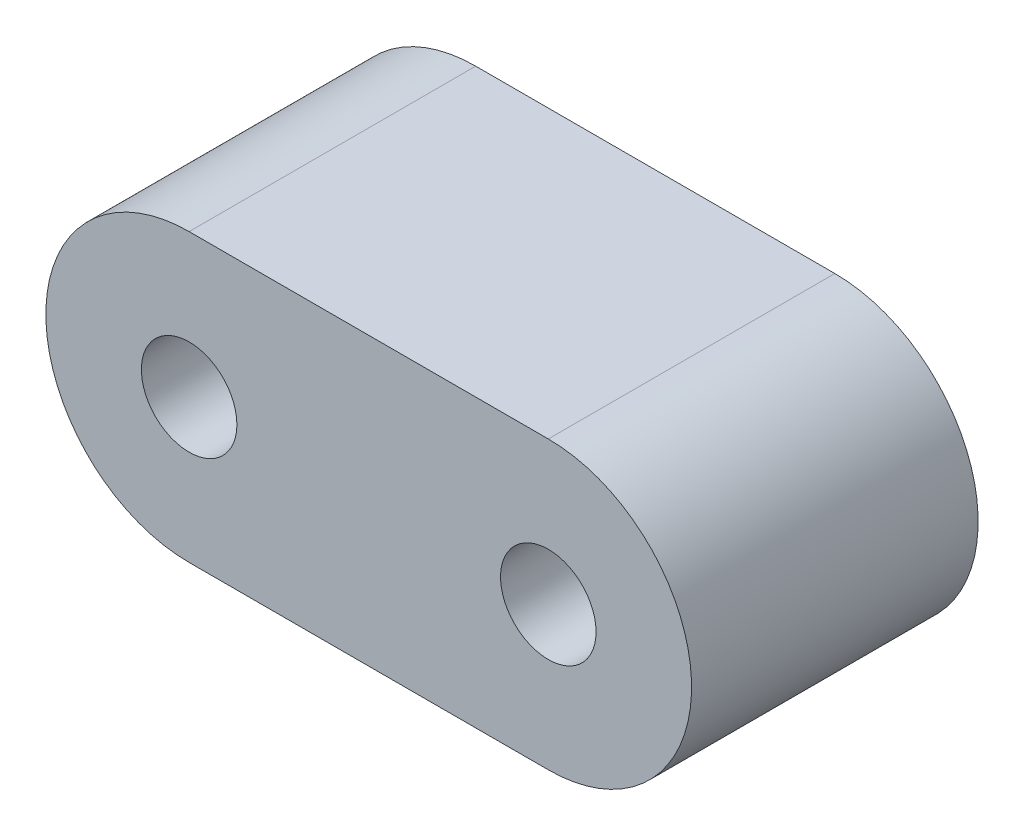
ISO-10303-21;
HEADER;
FILE_DESCRIPTION(('STEP AP214'),'2;1');
FILE_NAME('part.step','',(''),(''),'','','');
FILE_SCHEMA(('AUTOMOTIVE_DESIGN { 1 0 10303 214 1 1 1 1 }'));
ENDSEC;
DATA;
#1=APPLICATION_CONTEXT('core data for automotive mechanical design processes');
#2=APPLICATION_PROTOCOL_DEFINITION('international standard','automotive_design',2000,#1);
#3=PRODUCT_CONTEXT('',#1,'mechanical');
#4=PRODUCT('Part','Part','',(#3));
#5=PRODUCT_RELATED_PRODUCT_CATEGORY('part','',(#4));
#6=PRODUCT_DEFINITION_FORMATION('','',#4);
#7=PRODUCT_DEFINITION_CONTEXT('part definition',#1,'design');
#8=PRODUCT_DEFINITION('design','',#6,#7);
#9=PRODUCT_DEFINITION_SHAPE('','',#8);
#10=(LENGTH_UNIT() NAMED_UNIT(*) SI_UNIT(.MILLI.,.METRE.));
#11=(NAMED_UNIT(*) PLANE_ANGLE_UNIT() SI_UNIT($,.RADIAN.));
#12=(NAMED_UNIT(*) SI_UNIT($,.STERADIAN.) SOLID_ANGLE_UNIT());
#13=UNCERTAINTY_MEASURE_WITH_UNIT(LENGTH_MEASURE(1.E-05),#10,'distance_accuracy_value','');
#14=(GEOMETRIC_REPRESENTATION_CONTEXT(3) GLOBAL_UNCERTAINTY_ASSIGNED_CONTEXT((#13)) GLOBAL_UNIT_ASSIGNED_CONTEXT((#10,
#11,#12)) REPRESENTATION_CONTEXT('',''));
#15=CARTESIAN_POINT('',(0.,0.,0.));
#16=DIRECTION('',(0.,0.,1.));
#17=DIRECTION('',(1.,0.,0.));
#18=AXIS2_PLACEMENT_3D('',#15,#16,#17);
#19=CARTESIAN_POINT('',(0.,0.,1.5));
#20=DIRECTION('',(0.,0.,1.));
#21=DIRECTION('',(1.,0.,0.));
#22=AXIS2_PLACEMENT_3D('',#19,#20,#21);
#23=PLANE('',#22);
#24=CARTESIAN_POINT('',(0.,0.,1.5));
#25=DIRECTION('',(0.,0.,1.));
#26=DIRECTION('',(1.,0.,0.));
#27=AXIS2_PLACEMENT_3D('',#24,#25,#26);
#28=CIRCLE('',#27,0.5);
#29=CARTESIAN_POINT('',(0.5,0.,1.5));
#30=VERTEX_POINT('',#29);
#31=EDGE_CURVE('E100',#30,#30,#28,.T.);
#32=ORIENTED_EDGE('',*,*,#31,.F.);
#33=EDGE_LOOP('',(#32));
#34=FACE_BOUND('',#33,.T.);
#35=CARTESIAN_POINT('',(0.,0.,1.5));
#36=DIRECTION('',(0.,0.,1.));
#37=DIRECTION('',(1.,0.,0.));
#38=AXIS2_PLACEMENT_3D('',#35,#36,#37);
#39=CIRCLE('',#38,1.5);
#40=CARTESIAN_POINT('',(0.,1.5,1.5));
#41=VERTEX_POINT('',#40);
#42=CARTESIAN_POINT('',(0.,-1.5,1.5));
#43=VERTEX_POINT('',#42);
#44=EDGE_CURVE('E85',#41,#43,#39,.T.);
#45=ORIENTED_EDGE('',*,*,#44,.T.);
#46=DIRECTION('',(1.,0.,0.));
#47=VECTOR('',#46,1.);
#48=CARTESIAN_POINT('',(0.,-1.5,1.5));
#49=LINE('',#48,#47);
#50=CARTESIAN_POINT('',(3.76,-1.5,1.5));
#51=VERTEX_POINT('',#50);
#52=EDGE_CURVE('E80',#43,#51,#49,.T.);
#53=ORIENTED_EDGE('',*,*,#52,.T.);
#54=CARTESIAN_POINT('',(3.76,0.,1.5));
#55=DIRECTION('',(0.,0.,1.));
#56=DIRECTION('',(1.,0.,0.));
#57=AXIS2_PLACEMENT_3D('',#54,#55,#56);
#58=CIRCLE('',#57,1.5);
#59=CARTESIAN_POINT('',(3.76,1.5,1.5));
#60=VERTEX_POINT('',#59);
#61=EDGE_CURVE('E83',#51,#60,#58,.T.);
#62=ORIENTED_EDGE('',*,*,#61,.T.);
#63=DIRECTION('',(-1.,0.,0.));
#64=VECTOR('',#63,1.);
#65=CARTESIAN_POINT('',(0.,1.5,1.5));
#66=LINE('',#65,#64);
#67=EDGE_CURVE('E50',#60,#41,#66,.T.);
#68=ORIENTED_EDGE('',*,*,#67,.T.);
#69=EDGE_LOOP('',(#45,#53,#62,#68));
#70=FACE_BOUND('',#69,.T.);
#71=CARTESIAN_POINT('',(3.76,0.,1.5));
#72=DIRECTION('',(0.,0.,1.));
#73=DIRECTION('',(1.,0.,0.));
#74=AXIS2_PLACEMENT_3D('',#71,#72,#73);
#75=CIRCLE('',#74,0.500000000000001);
#76=CARTESIAN_POINT('',(4.26,0.,1.5));
#77=VERTEX_POINT('',#76);
#78=EDGE_CURVE('E115',#77,#77,#75,.T.);
#79=ORIENTED_EDGE('',*,*,#78,.F.);
#80=EDGE_LOOP('',(#79));
#81=FACE_BOUND('',#80,.T.);
#82=ADVANCED_FACE('F33',(#34,#70,#81),#23,.T.);
#83=CARTESIAN_POINT('',(0.,0.,-1.5));
#84=DIRECTION('',(0.,0.,1.));
#85=DIRECTION('',(1.,0.,0.));
#86=AXIS2_PLACEMENT_3D('',#83,#84,#85);
#87=PLANE('',#86);
#88=CARTESIAN_POINT('',(0.,0.,-1.5));
#89=DIRECTION('',(0.,0.,1.));
#90=DIRECTION('',(1.,0.,0.));
#91=AXIS2_PLACEMENT_3D('',#88,#89,#90);
#92=CIRCLE('',#91,1.5);
#93=CARTESIAN_POINT('',(0.,1.5,-1.5));
#94=VERTEX_POINT('',#93);
#95=CARTESIAN_POINT('',(0.,-1.5,-1.5));
#96=VERTEX_POINT('',#95);
#97=EDGE_CURVE('E97',#94,#96,#92,.T.);
#98=ORIENTED_EDGE('',*,*,#97,.F.);
#99=DIRECTION('',(-1.,0.,0.));
#100=VECTOR('',#99,1.);
#101=CARTESIAN_POINT('',(0.,1.5,-1.5));
#102=LINE('',#101,#100);
#103=CARTESIAN_POINT('',(3.76,1.5,-1.5));
#104=VERTEX_POINT('',#103);
#105=EDGE_CURVE('E73',#104,#94,#102,.T.);
#106=ORIENTED_EDGE('',*,*,#105,.F.);
#107=CARTESIAN_POINT('',(3.76,0.,-1.5));
#108=DIRECTION('',(0.,0.,1.));
#109=DIRECTION('',(1.,0.,0.));
#110=AXIS2_PLACEMENT_3D('',#107,#108,#109);
#111=CIRCLE('',#110,1.5);
#112=CARTESIAN_POINT('',(3.76,-1.5,-1.5));
#113=VERTEX_POINT('',#112);
#114=EDGE_CURVE('E67',#113,#104,#111,.T.);
#115=ORIENTED_EDGE('',*,*,#114,.F.);
#116=DIRECTION('',(1.,0.,0.));
#117=VECTOR('',#116,1.);
#118=CARTESIAN_POINT('',(0.,-1.5,-1.5));
#119=LINE('',#118,#117);
#120=EDGE_CURVE('E89',#96,#113,#119,.T.);
#121=ORIENTED_EDGE('',*,*,#120,.F.);
#122=EDGE_LOOP('',(#98,#106,#115,#121));
#123=FACE_BOUND('',#122,.T.);
#124=CARTESIAN_POINT('',(0.,0.,-1.5));
#125=DIRECTION('',(0.,0.,1.));
#126=DIRECTION('',(1.,0.,0.));
#127=AXIS2_PLACEMENT_3D('',#124,#125,#126);
#128=CIRCLE('',#127,0.5);
#129=CARTESIAN_POINT('',(0.5,0.,-1.5));
#130=VERTEX_POINT('',#129);
#131=EDGE_CURVE('E112',#130,#130,#128,.T.);
#132=ORIENTED_EDGE('',*,*,#131,.T.);
#133=EDGE_LOOP('',(#132));
#134=FACE_BOUND('',#133,.T.);
#135=CARTESIAN_POINT('',(3.76,0.,-1.5));
#136=DIRECTION('',(0.,0.,1.));
#137=DIRECTION('',(1.,0.,0.));
#138=AXIS2_PLACEMENT_3D('',#135,#136,#137);
#139=CIRCLE('',#138,0.500000000000001);
#140=CARTESIAN_POINT('',(4.26,0.,-1.5));
#141=VERTEX_POINT('',#140);
#142=EDGE_CURVE('E118',#141,#141,#139,.T.);
#143=ORIENTED_EDGE('',*,*,#142,.T.);
#144=EDGE_LOOP('',(#143));
#145=FACE_BOUND('',#144,.T.);
#146=ADVANCED_FACE('F108',(#123,#134,#145),#87,.F.);
#147=CARTESIAN_POINT('',(0.,0.,1.5));
#148=DIRECTION('',(0.,0.,-1.));
#149=DIRECTION('',(-1.,0.,0.));
#150=AXIS2_PLACEMENT_3D('',#147,#148,#149);
#151=CYLINDRICAL_SURFACE('',#150,1.5);
#152=ORIENTED_EDGE('',*,*,#97,.T.);
#153=DIRECTION('',(0.,0.,-1.));
#154=VECTOR('',#153,1.);
#155=CARTESIAN_POINT('',(0.,-1.5,1.5));
#156=LINE('',#155,#154);
#157=EDGE_CURVE('E11',#43,#96,#156,.T.);
#158=ORIENTED_EDGE('',*,*,#157,.F.);
#159=ORIENTED_EDGE('',*,*,#44,.F.);
#160=DIRECTION('',(0.,0.,-1.));
#161=VECTOR('',#160,1.);
#162=CARTESIAN_POINT('',(0.,1.5,1.5));
#163=LINE('',#162,#161);
#164=EDGE_CURVE('E93',#41,#94,#163,.T.);
#165=ORIENTED_EDGE('',*,*,#164,.T.);
#166=EDGE_LOOP('',(#152,#158,#159,#165));
#167=FACE_BOUND('',#166,.T.);
#168=ADVANCED_FACE('F35',(#167),#151,.T.);
#169=CARTESIAN_POINT('',(0.,-1.5,1.5));
#170=DIRECTION('',(0.,1.,0.));
#171=DIRECTION('',(0.,0.,1.));
#172=AXIS2_PLACEMENT_3D('',#169,#170,#171);
#173=PLANE('',#172);
#174=ORIENTED_EDGE('',*,*,#120,.T.);
#175=DIRECTION('',(0.,0.,-1.));
#176=VECTOR('',#175,1.);
#177=CARTESIAN_POINT('',(3.76,-1.5,1.5));
#178=LINE('',#177,#176);
#179=EDGE_CURVE('E42',#51,#113,#178,.T.);
#180=ORIENTED_EDGE('',*,*,#179,.F.);
#181=ORIENTED_EDGE('',*,*,#52,.F.);
#182=ORIENTED_EDGE('',*,*,#157,.T.);
#183=EDGE_LOOP('',(#174,#180,#181,#182));
#184=FACE_BOUND('',#183,.T.);
#185=ADVANCED_FACE('F88',(#184),#173,.F.);
#186=CARTESIAN_POINT('',(3.76,0.,1.5));
#187=DIRECTION('',(0.,0.,-1.));
#188=DIRECTION('',(-1.,0.,0.));
#189=AXIS2_PLACEMENT_3D('',#186,#187,#188);
#190=CYLINDRICAL_SURFACE('',#189,1.5);
#191=ORIENTED_EDGE('',*,*,#114,.T.);
#192=DIRECTION('',(0.,0.,-1.));
#193=VECTOR('',#192,1.);
#194=CARTESIAN_POINT('',(3.76,1.5,1.5));
#195=LINE('',#194,#193);
#196=EDGE_CURVE('E90',#60,#104,#195,.T.);
#197=ORIENTED_EDGE('',*,*,#196,.F.);
#198=ORIENTED_EDGE('',*,*,#61,.F.);
#199=ORIENTED_EDGE('',*,*,#179,.T.);
#200=EDGE_LOOP('',(#191,#197,#198,#199));
#201=FACE_BOUND('',#200,.T.);
#202=ADVANCED_FACE('F91',(#201),#190,.T.);
#203=CARTESIAN_POINT('',(0.,1.5,1.5));
#204=DIRECTION('',(0.,-1.,0.));
#205=DIRECTION('',(0.,0.,-1.));
#206=AXIS2_PLACEMENT_3D('',#203,#204,#205);
#207=PLANE('',#206);
#208=ORIENTED_EDGE('',*,*,#105,.T.);
#209=ORIENTED_EDGE('',*,*,#164,.F.);
#210=ORIENTED_EDGE('',*,*,#67,.F.);
#211=ORIENTED_EDGE('',*,*,#196,.T.);
#212=EDGE_LOOP('',(#208,#209,#210,#211));
#213=FACE_BOUND('',#212,.T.);
#214=ADVANCED_FACE('F105',(#213),#207,.F.);
#215=CARTESIAN_POINT('',(0.,0.,1.5));
#216=DIRECTION('',(0.,0.,-1.));
#217=DIRECTION('',(-1.,0.,0.));
#218=AXIS2_PLACEMENT_3D('',#215,#216,#217);
#219=CYLINDRICAL_SURFACE('',#218,0.5);
#220=ORIENTED_EDGE('',*,*,#31,.T.);
#221=EDGE_LOOP('',(#220));
#222=FACE_BOUND('',#221,.T.);
#223=ORIENTED_EDGE('',*,*,#131,.F.);
#224=EDGE_LOOP('',(#223));
#225=FACE_BOUND('',#224,.T.);
#226=ADVANCED_FACE('F135',(#222,#225),#219,.F.);
#227=CARTESIAN_POINT('',(3.76,0.,1.5));
#228=DIRECTION('',(0.,0.,-1.));
#229=DIRECTION('',(-1.,0.,0.));
#230=AXIS2_PLACEMENT_3D('',#227,#228,#229);
#231=CYLINDRICAL_SURFACE('',#230,0.500000000000001);
#232=ORIENTED_EDGE('',*,*,#78,.T.);
#233=EDGE_LOOP('',(#232));
#234=FACE_BOUND('',#233,.T.);
#235=ORIENTED_EDGE('',*,*,#142,.F.);
#236=EDGE_LOOP('',(#235));
#237=FACE_BOUND('',#236,.T.);
#238=ADVANCED_FACE('F124',(#234,#237),#231,.F.);
#239=CLOSED_SHELL('',(#82,#146,#168,#185,#202,#214,#226,#238));
#240=MANIFOLD_SOLID_BREP('B2',#239);
#241=ADVANCED_BREP_SHAPE_REPRESENTATION('',(#18,#240),#14);
#242=SHAPE_DEFINITION_REPRESENTATION(#9,#241);
ENDSEC;
END-ISO-10303-21;
